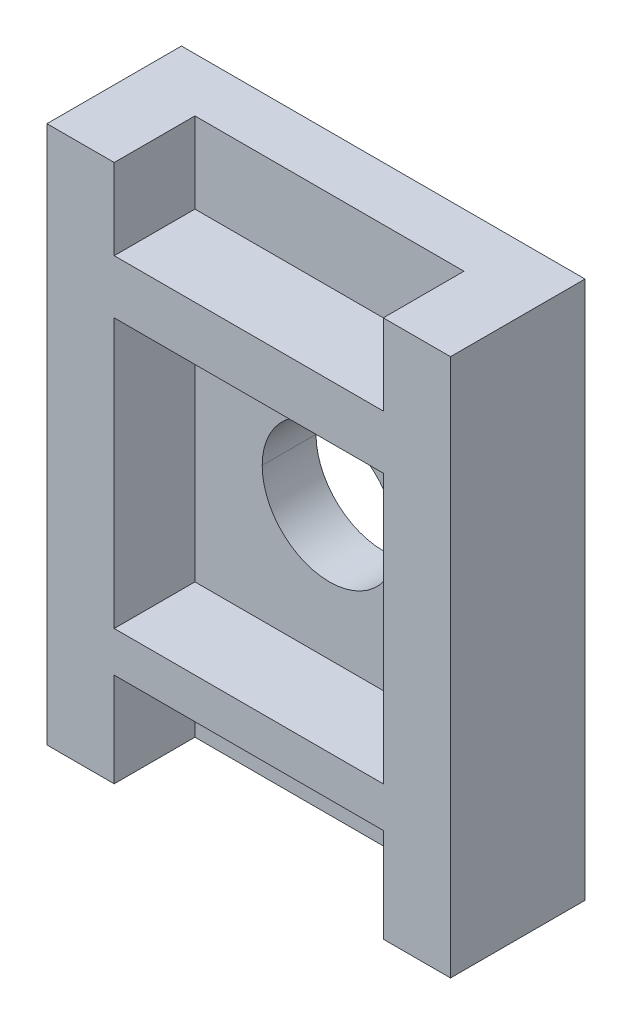
ISO-10303-21;
HEADER;
FILE_DESCRIPTION(('STEP AP214'),'2;1');
FILE_NAME('part.step','',(''),(''),'','','');
FILE_SCHEMA(('AUTOMOTIVE_DESIGN { 1 0 10303 214 1 1 1 1 }'));
ENDSEC;
DATA;
#1=APPLICATION_CONTEXT('core data for automotive mechanical design processes');
#2=APPLICATION_PROTOCOL_DEFINITION('international standard','automotive_design',2000,#1);
#3=PRODUCT_CONTEXT('',#1,'mechanical');
#4=PRODUCT('Part','Part','',(#3));
#5=PRODUCT_RELATED_PRODUCT_CATEGORY('part','',(#4));
#6=PRODUCT_DEFINITION_FORMATION('','',#4);
#7=PRODUCT_DEFINITION_CONTEXT('part definition',#1,'design');
#8=PRODUCT_DEFINITION('design','',#6,#7);
#9=PRODUCT_DEFINITION_SHAPE('','',#8);
#10=(LENGTH_UNIT() NAMED_UNIT(*) SI_UNIT(.MILLI.,.METRE.));
#11=(NAMED_UNIT(*) PLANE_ANGLE_UNIT() SI_UNIT($,.RADIAN.));
#12=(NAMED_UNIT(*) SI_UNIT($,.STERADIAN.) SOLID_ANGLE_UNIT());
#13=UNCERTAINTY_MEASURE_WITH_UNIT(LENGTH_MEASURE(1.E-05),#10,'distance_accuracy_value','');
#14=(GEOMETRIC_REPRESENTATION_CONTEXT(3) GLOBAL_UNCERTAINTY_ASSIGNED_CONTEXT((#13)) GLOBAL_UNIT_ASSIGNED_CONTEXT((#10,
#11,#12)) REPRESENTATION_CONTEXT('',''));
#15=CARTESIAN_POINT('',(0.,0.,0.));
#16=DIRECTION('',(0.,0.,1.));
#17=DIRECTION('',(1.,0.,0.));
#18=AXIS2_PLACEMENT_3D('',#15,#16,#17);
#19=CARTESIAN_POINT('',(0.,0.,2.));
#20=DIRECTION('',(0.,0.,-1.));
#21=DIRECTION('',(0.,-1.,0.));
#22=AXIS2_PLACEMENT_3D('',#19,#20,#21);
#23=PLANE('',#22);
#24=DIRECTION('',(0.,-1.,0.));
#25=VECTOR('',#24,1.);
#26=CARTESIAN_POINT('',(2.5,0.,2.));
#27=LINE('',#26,#25);
#28=CARTESIAN_POINT('',(2.5,3.5,2.));
#29=VERTEX_POINT('',#28);
#30=CARTESIAN_POINT('',(2.5,0.,2.));
#31=VERTEX_POINT('',#30);
#32=EDGE_CURVE('E219',#29,#31,#27,.T.);
#33=ORIENTED_EDGE('',*,*,#32,.T.);
#34=DIRECTION('',(1.,0.,0.));
#35=VECTOR('',#34,1.);
#36=CARTESIAN_POINT('',(2.5,0.,2.));
#37=LINE('',#36,#35);
#38=CARTESIAN_POINT('',(12.5,0.,2.));
#39=VERTEX_POINT('',#38);
#40=EDGE_CURVE('E266',#31,#39,#37,.T.);
#41=ORIENTED_EDGE('',*,*,#40,.T.);
#42=DIRECTION('',(0.,1.,0.));
#43=VECTOR('',#42,1.);
#44=CARTESIAN_POINT('',(12.5,0.,2.));
#45=LINE('',#44,#43);
#46=CARTESIAN_POINT('',(12.5,3.5,2.));
#47=VERTEX_POINT('',#46);
#48=EDGE_CURVE('E11',#39,#47,#45,.T.);
#49=ORIENTED_EDGE('',*,*,#48,.T.);
#50=DIRECTION('',(-1.,0.,0.));
#51=VECTOR('',#50,1.);
#52=CARTESIAN_POINT('',(2.5,3.5,2.));
#53=LINE('',#52,#51);
#54=EDGE_CURVE('E21',#47,#29,#53,.T.);
#55=ORIENTED_EDGE('',*,*,#54,.T.);
#56=EDGE_LOOP('',(#33,#41,#49,#55));
#57=FACE_BOUND('',#56,.T.);
#58=ADVANCED_FACE('F17',(#57),#23,.F.);
#59=CARTESIAN_POINT('',(12.5,0.,2.));
#60=DIRECTION('',(1.,0.,0.));
#61=DIRECTION('',(0.,1.,0.));
#62=AXIS2_PLACEMENT_3D('',#59,#60,#61);
#63=PLANE('',#62);
#64=DIRECTION('',(0.,1.,0.));
#65=VECTOR('',#64,1.);
#66=CARTESIAN_POINT('',(12.5,0.,5.));
#67=LINE('',#66,#65);
#68=CARTESIAN_POINT('',(12.5,0.,5.));
#69=VERTEX_POINT('',#68);
#70=CARTESIAN_POINT('',(12.5,3.5,5.));
#71=VERTEX_POINT('',#70);
#72=EDGE_CURVE('E321',#69,#71,#67,.T.);
#73=ORIENTED_EDGE('',*,*,#72,.T.);
#74=DIRECTION('',(0.,0.,1.));
#75=VECTOR('',#74,1.);
#76=CARTESIAN_POINT('',(12.5,3.5,2.));
#77=LINE('',#76,#75);
#78=EDGE_CURVE('E28',#47,#71,#77,.T.);
#79=ORIENTED_EDGE('',*,*,#78,.F.);
#80=ORIENTED_EDGE('',*,*,#48,.F.);
#81=DIRECTION('',(0.,0.,1.));
#82=VECTOR('',#81,1.);
#83=CARTESIAN_POINT('',(12.5,0.,2.));
#84=LINE('',#83,#82);
#85=EDGE_CURVE('E298',#39,#69,#84,.T.);
#86=ORIENTED_EDGE('',*,*,#85,.T.);
#87=EDGE_LOOP('',(#73,#79,#80,#86));
#88=FACE_BOUND('',#87,.T.);
#89=ADVANCED_FACE('F422',(#88),#63,.F.);
#90=CARTESIAN_POINT('',(2.5,3.5,2.));
#91=DIRECTION('',(0.,1.,0.));
#92=DIRECTION('',(1.,0.,0.));
#93=AXIS2_PLACEMENT_3D('',#90,#91,#92);
#94=PLANE('',#93);
#95=DIRECTION('',(-1.,0.,0.));
#96=VECTOR('',#95,1.);
#97=CARTESIAN_POINT('',(2.5,3.5,5.));
#98=LINE('',#97,#96);
#99=CARTESIAN_POINT('',(2.5,3.5,5.));
#100=VERTEX_POINT('',#99);
#101=EDGE_CURVE('E326',#71,#100,#98,.T.);
#102=ORIENTED_EDGE('',*,*,#101,.T.);
#103=DIRECTION('',(0.,0.,1.));
#104=VECTOR('',#103,1.);
#105=CARTESIAN_POINT('',(2.5,3.5,2.));
#106=LINE('',#105,#104);
#107=EDGE_CURVE('E289',#29,#100,#106,.T.);
#108=ORIENTED_EDGE('',*,*,#107,.F.);
#109=ORIENTED_EDGE('',*,*,#54,.F.);
#110=ORIENTED_EDGE('',*,*,#78,.T.);
#111=EDGE_LOOP('',(#102,#108,#109,#110));
#112=FACE_BOUND('',#111,.T.);
#113=ADVANCED_FACE('F419',(#112),#94,.F.);
#114=CARTESIAN_POINT('',(2.5,0.,2.));
#115=DIRECTION('',(-1.,0.,0.));
#116=DIRECTION('',(0.,0.,1.));
#117=AXIS2_PLACEMENT_3D('',#114,#115,#116);
#118=PLANE('',#117);
#119=DIRECTION('',(0.,-1.,0.));
#120=VECTOR('',#119,1.);
#121=CARTESIAN_POINT('',(2.5,0.,5.));
#122=LINE('',#121,#120);
#123=CARTESIAN_POINT('',(2.5,0.,5.));
#124=VERTEX_POINT('',#123);
#125=EDGE_CURVE('E319',#100,#124,#122,.T.);
#126=ORIENTED_EDGE('',*,*,#125,.T.);
#127=DIRECTION('',(0.,0.,1.));
#128=VECTOR('',#127,1.);
#129=CARTESIAN_POINT('',(2.5,0.,2.));
#130=LINE('',#129,#128);
#131=EDGE_CURVE('E268',#31,#124,#130,.T.);
#132=ORIENTED_EDGE('',*,*,#131,.F.);
#133=ORIENTED_EDGE('',*,*,#32,.F.);
#134=ORIENTED_EDGE('',*,*,#107,.T.);
#135=EDGE_LOOP('',(#126,#132,#133,#134));
#136=FACE_BOUND('',#135,.T.);
#137=ADVANCED_FACE('F415',(#136),#118,.F.);
#138=CARTESIAN_POINT('',(0.,0.,2.));
#139=DIRECTION('',(0.,0.,-1.));
#140=DIRECTION('',(0.,-1.,0.));
#141=AXIS2_PLACEMENT_3D('',#138,#139,#140);
#142=PLANE('',#141);
#143=DIRECTION('',(0.,1.,0.));
#144=VECTOR('',#143,1.);
#145=CARTESIAN_POINT('',(12.5,20.,2.));
#146=LINE('',#145,#144);
#147=CARTESIAN_POINT('',(12.5,17.,2.));
#148=VERTEX_POINT('',#147);
#149=CARTESIAN_POINT('',(12.5,20.,2.));
#150=VERTEX_POINT('',#149);
#151=EDGE_CURVE('E180',#148,#150,#146,.T.);
#152=ORIENTED_EDGE('',*,*,#151,.T.);
#153=DIRECTION('',(-1.,0.,0.));
#154=VECTOR('',#153,1.);
#155=CARTESIAN_POINT('',(12.5,20.,2.));
#156=LINE('',#155,#154);
#157=CARTESIAN_POINT('',(2.5,20.,2.));
#158=VERTEX_POINT('',#157);
#159=EDGE_CURVE('E311',#150,#158,#156,.T.);
#160=ORIENTED_EDGE('',*,*,#159,.T.);
#161=DIRECTION('',(0.,-1.,0.));
#162=VECTOR('',#161,1.);
#163=CARTESIAN_POINT('',(2.5,20.,2.));
#164=LINE('',#163,#162);
#165=CARTESIAN_POINT('',(2.5,17.,2.));
#166=VERTEX_POINT('',#165);
#167=EDGE_CURVE('E182',#158,#166,#164,.T.);
#168=ORIENTED_EDGE('',*,*,#167,.T.);
#169=DIRECTION('',(1.,0.,0.));
#170=VECTOR('',#169,1.);
#171=CARTESIAN_POINT('',(12.5,17.,2.));
#172=LINE('',#171,#170);
#173=EDGE_CURVE('E175',#166,#148,#172,.T.);
#174=ORIENTED_EDGE('',*,*,#173,.T.);
#175=EDGE_LOOP('',(#152,#160,#168,#174));
#176=FACE_BOUND('',#175,.T.);
#177=ADVANCED_FACE('F177',(#176),#142,.F.);
#178=CARTESIAN_POINT('',(2.5,20.,2.));
#179=DIRECTION('',(-1.,0.,0.));
#180=DIRECTION('',(0.,1.,0.));
#181=AXIS2_PLACEMENT_3D('',#178,#179,#180);
#182=PLANE('',#181);
#183=DIRECTION('',(0.,-1.,0.));
#184=VECTOR('',#183,1.);
#185=CARTESIAN_POINT('',(2.5,20.,5.));
#186=LINE('',#185,#184);
#187=CARTESIAN_POINT('',(2.5,20.,5.));
#188=VERTEX_POINT('',#187);
#189=CARTESIAN_POINT('',(2.5,17.,5.));
#190=VERTEX_POINT('',#189);
#191=EDGE_CURVE('E235',#188,#190,#186,.T.);
#192=ORIENTED_EDGE('',*,*,#191,.T.);
#193=DIRECTION('',(0.,0.,1.));
#194=VECTOR('',#193,1.);
#195=CARTESIAN_POINT('',(2.5,17.,2.));
#196=LINE('',#195,#194);
#197=EDGE_CURVE('E187',#166,#190,#196,.T.);
#198=ORIENTED_EDGE('',*,*,#197,.F.);
#199=ORIENTED_EDGE('',*,*,#167,.F.);
#200=DIRECTION('',(0.,0.,1.));
#201=VECTOR('',#200,1.);
#202=CARTESIAN_POINT('',(2.5,20.,2.));
#203=LINE('',#202,#201);
#204=EDGE_CURVE('E238',#158,#188,#203,.T.);
#205=ORIENTED_EDGE('',*,*,#204,.T.);
#206=EDGE_LOOP('',(#192,#198,#199,#205));
#207=FACE_BOUND('',#206,.T.);
#208=ADVANCED_FACE('F236',(#207),#182,.F.);
#209=CARTESIAN_POINT('',(12.5,17.,2.));
#210=DIRECTION('',(0.,-1.,0.));
#211=DIRECTION('',(0.,0.,-1.));
#212=AXIS2_PLACEMENT_3D('',#209,#210,#211);
#213=PLANE('',#212);
#214=DIRECTION('',(1.,0.,0.));
#215=VECTOR('',#214,1.);
#216=CARTESIAN_POINT('',(12.5,17.,5.));
#217=LINE('',#216,#215);
#218=CARTESIAN_POINT('',(12.5,17.,5.));
#219=VERTEX_POINT('',#218);
#220=EDGE_CURVE('E193',#190,#219,#217,.T.);
#221=ORIENTED_EDGE('',*,*,#220,.T.);
#222=DIRECTION('',(0.,0.,1.));
#223=VECTOR('',#222,1.);
#224=CARTESIAN_POINT('',(12.5,17.,2.));
#225=LINE('',#224,#223);
#226=EDGE_CURVE('E188',#148,#219,#225,.T.);
#227=ORIENTED_EDGE('',*,*,#226,.F.);
#228=ORIENTED_EDGE('',*,*,#173,.F.);
#229=ORIENTED_EDGE('',*,*,#197,.T.);
#230=EDGE_LOOP('',(#221,#227,#228,#229));
#231=FACE_BOUND('',#230,.T.);
#232=ADVANCED_FACE('F191',(#231),#213,.F.);
#233=CARTESIAN_POINT('',(12.5,20.,2.));
#234=DIRECTION('',(1.,0.,0.));
#235=DIRECTION('',(0.,1.,0.));
#236=AXIS2_PLACEMENT_3D('',#233,#234,#235);
#237=PLANE('',#236);
#238=DIRECTION('',(0.,1.,0.));
#239=VECTOR('',#238,1.);
#240=CARTESIAN_POINT('',(12.5,20.,5.));
#241=LINE('',#240,#239);
#242=CARTESIAN_POINT('',(12.5,20.,5.));
#243=VERTEX_POINT('',#242);
#244=EDGE_CURVE('E248',#219,#243,#241,.T.);
#245=ORIENTED_EDGE('',*,*,#244,.T.);
#246=DIRECTION('',(0.,0.,1.));
#247=VECTOR('',#246,1.);
#248=CARTESIAN_POINT('',(12.5,20.,2.));
#249=LINE('',#248,#247);
#250=EDGE_CURVE('E200',#150,#243,#249,.T.);
#251=ORIENTED_EDGE('',*,*,#250,.F.);
#252=ORIENTED_EDGE('',*,*,#151,.F.);
#253=ORIENTED_EDGE('',*,*,#226,.T.);
#254=EDGE_LOOP('',(#245,#251,#252,#253));
#255=FACE_BOUND('',#254,.T.);
#256=ADVANCED_FACE('F199',(#255),#237,.F.);
#257=CARTESIAN_POINT('',(0.,0.,2.));
#258=DIRECTION('',(0.,0.,1.));
#259=DIRECTION('',(1.,0.,0.));
#260=AXIS2_PLACEMENT_3D('',#257,#258,#259);
#261=PLANE('',#260);
#262=CARTESIAN_POINT('',(7.5,10.0000000000006,2.));
#263=DIRECTION('',(0.,0.,1.));
#264=DIRECTION('',(1.,0.,0.));
#265=AXIS2_PLACEMENT_3D('',#262,#263,#264);
#266=CIRCLE('',#265,2.5);
#267=CARTESIAN_POINT('',(5.,10.0000000000006,2.));
#268=VERTEX_POINT('',#267);
#269=CARTESIAN_POINT('',(10.,10.0000000000006,2.));
#270=VERTEX_POINT('',#269);
#271=EDGE_CURVE('E334',#268,#270,#266,.T.);
#272=ORIENTED_EDGE('',*,*,#271,.F.);
#273=CARTESIAN_POINT('',(7.5,10.0000000000006,2.));
#274=DIRECTION('',(0.,0.,1.));
#275=DIRECTION('',(1.,0.,0.));
#276=AXIS2_PLACEMENT_3D('',#273,#274,#275);
#277=CIRCLE('',#276,2.5);
#278=EDGE_CURVE('E330',#270,#268,#277,.T.);
#279=ORIENTED_EDGE('',*,*,#278,.F.);
#280=EDGE_LOOP('',(#272,#279));
#281=FACE_BOUND('',#280,.T.);
#282=DIRECTION('',(0.,-1.,0.));
#283=VECTOR('',#282,1.);
#284=CARTESIAN_POINT('',(2.5,15.,2.));
#285=LINE('',#284,#283);
#286=CARTESIAN_POINT('',(2.5,15.,2.));
#287=VERTEX_POINT('',#286);
#288=CARTESIAN_POINT('',(2.5,5.,2.));
#289=VERTEX_POINT('',#288);
#290=EDGE_CURVE('E367',#287,#289,#285,.T.);
#291=ORIENTED_EDGE('',*,*,#290,.T.);
#292=DIRECTION('',(1.,0.,0.));
#293=VECTOR('',#292,1.);
#294=CARTESIAN_POINT('',(2.5,5.,2.));
#295=LINE('',#294,#293);
#296=CARTESIAN_POINT('',(12.5,5.,2.));
#297=VERTEX_POINT('',#296);
#298=EDGE_CURVE('E203',#289,#297,#295,.T.);
#299=ORIENTED_EDGE('',*,*,#298,.T.);
#300=DIRECTION('',(0.,1.,0.));
#301=VECTOR('',#300,1.);
#302=CARTESIAN_POINT('',(12.5,15.,2.));
#303=LINE('',#302,#301);
#304=CARTESIAN_POINT('',(12.5,15.,2.));
#305=VERTEX_POINT('',#304);
#306=EDGE_CURVE('E217',#297,#305,#303,.T.);
#307=ORIENTED_EDGE('',*,*,#306,.T.);
#308=DIRECTION('',(-1.,0.,0.));
#309=VECTOR('',#308,1.);
#310=CARTESIAN_POINT('',(2.5,15.,2.));
#311=LINE('',#310,#309);
#312=EDGE_CURVE('E293',#305,#287,#311,.T.);
#313=ORIENTED_EDGE('',*,*,#312,.T.);
#314=EDGE_LOOP('',(#291,#299,#307,#313));
#315=FACE_BOUND('',#314,.T.);
#316=ADVANCED_FACE('F503',(#281,#315),#261,.T.);
#317=CARTESIAN_POINT('',(2.5,5.,2.));
#318=DIRECTION('',(0.,-1.,0.));
#319=DIRECTION('',(0.,0.,-1.));
#320=AXIS2_PLACEMENT_3D('',#317,#318,#319);
#321=PLANE('',#320);
#322=DIRECTION('',(1.,0.,0.));
#323=VECTOR('',#322,1.);
#324=CARTESIAN_POINT('',(2.5,5.,5.));
#325=LINE('',#324,#323);
#326=CARTESIAN_POINT('',(2.5,5.,5.));
#327=VERTEX_POINT('',#326);
#328=CARTESIAN_POINT('',(12.5,5.,5.));
#329=VERTEX_POINT('',#328);
#330=EDGE_CURVE('E265',#327,#329,#325,.T.);
#331=ORIENTED_EDGE('',*,*,#330,.T.);
#332=DIRECTION('',(0.,0.,1.));
#333=VECTOR('',#332,1.);
#334=CARTESIAN_POINT('',(12.5,5.,2.));
#335=LINE('',#334,#333);
#336=EDGE_CURVE('E210',#297,#329,#335,.T.);
#337=ORIENTED_EDGE('',*,*,#336,.F.);
#338=ORIENTED_EDGE('',*,*,#298,.F.);
#339=DIRECTION('',(0.,0.,1.));
#340=VECTOR('',#339,1.);
#341=CARTESIAN_POINT('',(2.5,5.,2.));
#342=LINE('',#341,#340);
#343=EDGE_CURVE('E301',#289,#327,#342,.T.);
#344=ORIENTED_EDGE('',*,*,#343,.T.);
#345=EDGE_LOOP('',(#331,#337,#338,#344));
#346=FACE_BOUND('',#345,.T.);
#347=ADVANCED_FACE('F499',(#346),#321,.F.);
#348=CARTESIAN_POINT('',(12.5,15.,2.));
#349=DIRECTION('',(1.,0.,0.));
#350=DIRECTION('',(0.,1.,0.));
#351=AXIS2_PLACEMENT_3D('',#348,#349,#350);
#352=PLANE('',#351);
#353=DIRECTION('',(0.,1.,0.));
#354=VECTOR('',#353,1.);
#355=CARTESIAN_POINT('',(12.5,15.,5.));
#356=LINE('',#355,#354);
#357=CARTESIAN_POINT('',(12.5,15.,5.));
#358=VERTEX_POINT('',#357);
#359=EDGE_CURVE('E338',#329,#358,#356,.T.);
#360=ORIENTED_EDGE('',*,*,#359,.T.);
#361=DIRECTION('',(0.,0.,1.));
#362=VECTOR('',#361,1.);
#363=CARTESIAN_POINT('',(12.5,15.,2.));
#364=LINE('',#363,#362);
#365=EDGE_CURVE('E290',#305,#358,#364,.T.);
#366=ORIENTED_EDGE('',*,*,#365,.F.);
#367=ORIENTED_EDGE('',*,*,#306,.F.);
#368=ORIENTED_EDGE('',*,*,#336,.T.);
#369=EDGE_LOOP('',(#360,#366,#367,#368));
#370=FACE_BOUND('',#369,.T.);
#371=ADVANCED_FACE('F483',(#370),#352,.F.);
#372=CARTESIAN_POINT('',(2.5,15.,2.));
#373=DIRECTION('',(0.,1.,0.));
#374=DIRECTION('',(1.,0.,0.));
#375=AXIS2_PLACEMENT_3D('',#372,#373,#374);
#376=PLANE('',#375);
#377=DIRECTION('',(-1.,0.,0.));
#378=VECTOR('',#377,1.);
#379=CARTESIAN_POINT('',(2.5,15.,5.));
#380=LINE('',#379,#378);
#381=CARTESIAN_POINT('',(2.5,15.,5.));
#382=VERTEX_POINT('',#381);
#383=EDGE_CURVE('E264',#358,#382,#380,.T.);
#384=ORIENTED_EDGE('',*,*,#383,.T.);
#385=DIRECTION('',(0.,0.,1.));
#386=VECTOR('',#385,1.);
#387=CARTESIAN_POINT('',(2.5,15.,2.));
#388=LINE('',#387,#386);
#389=EDGE_CURVE('E374',#287,#382,#388,.T.);
#390=ORIENTED_EDGE('',*,*,#389,.F.);
#391=ORIENTED_EDGE('',*,*,#312,.F.);
#392=ORIENTED_EDGE('',*,*,#365,.T.);
#393=EDGE_LOOP('',(#384,#390,#391,#392));
#394=FACE_BOUND('',#393,.T.);
#395=ADVANCED_FACE('F478',(#394),#376,.F.);
#396=CARTESIAN_POINT('',(2.5,15.,2.));
#397=DIRECTION('',(-1.,0.,0.));
#398=DIRECTION('',(0.,1.,0.));
#399=AXIS2_PLACEMENT_3D('',#396,#397,#398);
#400=PLANE('',#399);
#401=DIRECTION('',(0.,-1.,0.));
#402=VECTOR('',#401,1.);
#403=CARTESIAN_POINT('',(2.5,15.,5.));
#404=LINE('',#403,#402);
#405=EDGE_CURVE('E262',#382,#327,#404,.T.);
#406=ORIENTED_EDGE('',*,*,#405,.T.);
#407=ORIENTED_EDGE('',*,*,#343,.F.);
#408=ORIENTED_EDGE('',*,*,#290,.F.);
#409=ORIENTED_EDGE('',*,*,#389,.T.);
#410=EDGE_LOOP('',(#406,#407,#408,#409));
#411=FACE_BOUND('',#410,.T.);
#412=ADVANCED_FACE('F482',(#411),#400,.F.);
#413=CARTESIAN_POINT('',(0.,20.,5.));
#414=DIRECTION('',(0.,-1.,0.));
#415=DIRECTION('',(0.,0.,-1.));
#416=AXIS2_PLACEMENT_3D('',#413,#414,#415);
#417=PLANE('',#416);
#418=ORIENTED_EDGE('',*,*,#159,.F.);
#419=ORIENTED_EDGE('',*,*,#250,.T.);
#420=DIRECTION('',(-1.,0.,0.));
#421=VECTOR('',#420,1.);
#422=CARTESIAN_POINT('',(0.,20.,5.));
#423=LINE('',#422,#421);
#424=CARTESIAN_POINT('',(15.,20.,5.));
#425=VERTEX_POINT('',#424);
#426=EDGE_CURVE('E256',#425,#243,#423,.T.);
#427=ORIENTED_EDGE('',*,*,#426,.F.);
#428=DIRECTION('',(0.,0.,-1.));
#429=VECTOR('',#428,1.);
#430=CARTESIAN_POINT('',(15.,20.,5.));
#431=LINE('',#430,#429);
#432=CARTESIAN_POINT('',(15.,20.,0.));
#433=VERTEX_POINT('',#432);
#434=EDGE_CURVE('E314',#425,#433,#431,.T.);
#435=ORIENTED_EDGE('',*,*,#434,.T.);
#436=DIRECTION('',(-1.,0.,0.));
#437=VECTOR('',#436,1.);
#438=CARTESIAN_POINT('',(0.,20.,0.));
#439=LINE('',#438,#437);
#440=CARTESIAN_POINT('',(0.,20.,0.));
#441=VERTEX_POINT('',#440);
#442=EDGE_CURVE('E214',#433,#441,#439,.T.);
#443=ORIENTED_EDGE('',*,*,#442,.T.);
#444=DIRECTION('',(0.,0.,-1.));
#445=VECTOR('',#444,1.);
#446=CARTESIAN_POINT('',(0.,20.,5.));
#447=LINE('',#446,#445);
#448=CARTESIAN_POINT('',(0.,20.,5.));
#449=VERTEX_POINT('',#448);
#450=EDGE_CURVE('E269',#449,#441,#447,.T.);
#451=ORIENTED_EDGE('',*,*,#450,.F.);
#452=DIRECTION('',(-1.,0.,0.));
#453=VECTOR('',#452,1.);
#454=CARTESIAN_POINT('',(0.,20.,5.));
#455=LINE('',#454,#453);
#456=EDGE_CURVE('E243',#188,#449,#455,.T.);
#457=ORIENTED_EDGE('',*,*,#456,.F.);
#458=ORIENTED_EDGE('',*,*,#204,.F.);
#459=EDGE_LOOP('',(#418,#419,#427,#435,#443,#451,#457,#458));
#460=FACE_BOUND('',#459,.T.);
#461=ADVANCED_FACE('F404',(#460),#417,.F.);
#462=CARTESIAN_POINT('',(15.,0.,5.));
#463=DIRECTION('',(-1.,0.,0.));
#464=DIRECTION('',(0.,1.,0.));
#465=AXIS2_PLACEMENT_3D('',#462,#463,#464);
#466=PLANE('',#465);
#467=DIRECTION('',(0.,1.,0.));
#468=VECTOR('',#467,1.);
#469=CARTESIAN_POINT('',(15.,0.,0.));
#470=LINE('',#469,#468);
#471=CARTESIAN_POINT('',(15.,0.,0.));
#472=VERTEX_POINT('',#471);
#473=EDGE_CURVE('E227',#472,#433,#470,.T.);
#474=ORIENTED_EDGE('',*,*,#473,.T.);
#475=ORIENTED_EDGE('',*,*,#434,.F.);
#476=DIRECTION('',(0.,1.,0.));
#477=VECTOR('',#476,1.);
#478=CARTESIAN_POINT('',(15.,0.,5.));
#479=LINE('',#478,#477);
#480=CARTESIAN_POINT('',(15.,0.,5.));
#481=VERTEX_POINT('',#480);
#482=EDGE_CURVE('E260',#481,#425,#479,.T.);
#483=ORIENTED_EDGE('',*,*,#482,.F.);
#484=DIRECTION('',(0.,0.,-1.));
#485=VECTOR('',#484,1.);
#486=CARTESIAN_POINT('',(15.,0.,5.));
#487=LINE('',#486,#485);
#488=EDGE_CURVE('E275',#481,#472,#487,.T.);
#489=ORIENTED_EDGE('',*,*,#488,.T.);
#490=EDGE_LOOP('',(#474,#475,#483,#489));
#491=FACE_BOUND('',#490,.T.);
#492=ADVANCED_FACE('F400',(#491),#466,.F.);
#493=CARTESIAN_POINT('',(0.,0.,5.));
#494=DIRECTION('',(0.,1.,0.));
#495=DIRECTION('',(1.,0.,0.));
#496=AXIS2_PLACEMENT_3D('',#493,#494,#495);
#497=PLANE('',#496);
#498=ORIENTED_EDGE('',*,*,#40,.F.);
#499=ORIENTED_EDGE('',*,*,#131,.T.);
#500=DIRECTION('',(1.,0.,0.));
#501=VECTOR('',#500,1.);
#502=CARTESIAN_POINT('',(0.,0.,5.));
#503=LINE('',#502,#501);
#504=CARTESIAN_POINT('',(0.,0.,5.));
#505=VERTEX_POINT('',#504);
#506=EDGE_CURVE('E316',#505,#124,#503,.T.);
#507=ORIENTED_EDGE('',*,*,#506,.F.);
#508=DIRECTION('',(0.,0.,-1.));
#509=VECTOR('',#508,1.);
#510=CARTESIAN_POINT('',(0.,0.,5.));
#511=LINE('',#510,#509);
#512=CARTESIAN_POINT('',(0.,0.,0.));
#513=VERTEX_POINT('',#512);
#514=EDGE_CURVE('E226',#505,#513,#511,.T.);
#515=ORIENTED_EDGE('',*,*,#514,.T.);
#516=DIRECTION('',(1.,0.,0.));
#517=VECTOR('',#516,1.);
#518=CARTESIAN_POINT('',(0.,0.,0.));
#519=LINE('',#518,#517);
#520=EDGE_CURVE('E223',#513,#472,#519,.T.);
#521=ORIENTED_EDGE('',*,*,#520,.T.);
#522=ORIENTED_EDGE('',*,*,#488,.F.);
#523=DIRECTION('',(1.,0.,0.));
#524=VECTOR('',#523,1.);
#525=CARTESIAN_POINT('',(0.,0.,5.));
#526=LINE('',#525,#524);
#527=EDGE_CURVE('E325',#69,#481,#526,.T.);
#528=ORIENTED_EDGE('',*,*,#527,.F.);
#529=ORIENTED_EDGE('',*,*,#85,.F.);
#530=EDGE_LOOP('',(#498,#499,#507,#515,#521,#522,#528,#529));
#531=FACE_BOUND('',#530,.T.);
#532=ADVANCED_FACE('F408',(#531),#497,.F.);
#533=CARTESIAN_POINT('',(0.,0.,5.));
#534=DIRECTION('',(1.,0.,0.));
#535=DIRECTION('',(0.,1.,0.));
#536=AXIS2_PLACEMENT_3D('',#533,#534,#535);
#537=PLANE('',#536);
#538=DIRECTION('',(0.,-1.,0.));
#539=VECTOR('',#538,1.);
#540=CARTESIAN_POINT('',(0.,0.,0.));
#541=LINE('',#540,#539);
#542=EDGE_CURVE('E344',#441,#513,#541,.T.);
#543=ORIENTED_EDGE('',*,*,#542,.T.);
#544=ORIENTED_EDGE('',*,*,#514,.F.);
#545=DIRECTION('',(0.,-1.,0.));
#546=VECTOR('',#545,1.);
#547=CARTESIAN_POINT('',(0.,0.,5.));
#548=LINE('',#547,#546);
#549=EDGE_CURVE('E351',#449,#505,#548,.T.);
#550=ORIENTED_EDGE('',*,*,#549,.F.);
#551=ORIENTED_EDGE('',*,*,#450,.T.);
#552=EDGE_LOOP('',(#543,#544,#550,#551));
#553=FACE_BOUND('',#552,.T.);
#554=ADVANCED_FACE('F470',(#553),#537,.F.);
#555=CARTESIAN_POINT('',(0.,0.,0.));
#556=DIRECTION('',(0.,0.,-1.));
#557=DIRECTION('',(0.,-1.,0.));
#558=AXIS2_PLACEMENT_3D('',#555,#556,#557);
#559=PLANE('',#558);
#560=CARTESIAN_POINT('',(7.5,10.0000000000006,0.));
#561=DIRECTION('',(0.,0.,1.));
#562=DIRECTION('',(1.,0.,0.));
#563=AXIS2_PLACEMENT_3D('',#560,#561,#562);
#564=CIRCLE('',#563,2.5);
#565=CARTESIAN_POINT('',(5.,10.0000000000006,0.));
#566=VERTEX_POINT('',#565);
#567=CARTESIAN_POINT('',(10.,10.0000000000006,0.));
#568=VERTEX_POINT('',#567);
#569=EDGE_CURVE('E304',#566,#568,#564,.T.);
#570=ORIENTED_EDGE('',*,*,#569,.T.);
#571=CARTESIAN_POINT('',(7.5,10.0000000000006,0.));
#572=DIRECTION('',(0.,0.,1.));
#573=DIRECTION('',(1.,0.,0.));
#574=AXIS2_PLACEMENT_3D('',#571,#572,#573);
#575=CIRCLE('',#574,2.5);
#576=EDGE_CURVE('E320',#568,#566,#575,.T.);
#577=ORIENTED_EDGE('',*,*,#576,.T.);
#578=EDGE_LOOP('',(#570,#577));
#579=FACE_BOUND('',#578,.T.);
#580=ORIENTED_EDGE('',*,*,#542,.F.);
#581=ORIENTED_EDGE('',*,*,#442,.F.);
#582=ORIENTED_EDGE('',*,*,#473,.F.);
#583=ORIENTED_EDGE('',*,*,#520,.F.);
#584=EDGE_LOOP('',(#580,#581,#582,#583));
#585=FACE_BOUND('',#584,.T.);
#586=ADVANCED_FACE('F19',(#579,#585),#559,.T.);
#587=CARTESIAN_POINT('',(0.,0.,5.));
#588=DIRECTION('',(0.,0.,-1.));
#589=DIRECTION('',(0.,-1.,0.));
#590=AXIS2_PLACEMENT_3D('',#587,#588,#589);
#591=PLANE('',#590);
#592=ORIENTED_EDGE('',*,*,#330,.F.);
#593=ORIENTED_EDGE('',*,*,#405,.F.);
#594=ORIENTED_EDGE('',*,*,#383,.F.);
#595=ORIENTED_EDGE('',*,*,#359,.F.);
#596=EDGE_LOOP('',(#592,#593,#594,#595));
#597=FACE_BOUND('',#596,.T.);
#598=ORIENTED_EDGE('',*,*,#506,.T.);
#599=ORIENTED_EDGE('',*,*,#125,.F.);
#600=ORIENTED_EDGE('',*,*,#101,.F.);
#601=ORIENTED_EDGE('',*,*,#72,.F.);
#602=ORIENTED_EDGE('',*,*,#527,.T.);
#603=ORIENTED_EDGE('',*,*,#482,.T.);
#604=ORIENTED_EDGE('',*,*,#426,.T.);
#605=ORIENTED_EDGE('',*,*,#244,.F.);
#606=ORIENTED_EDGE('',*,*,#220,.F.);
#607=ORIENTED_EDGE('',*,*,#191,.F.);
#608=ORIENTED_EDGE('',*,*,#456,.T.);
#609=ORIENTED_EDGE('',*,*,#549,.T.);
#610=EDGE_LOOP('',(#598,#599,#600,#601,#602,#603,#604,#605,#606,#607,#608,#609));
#611=FACE_BOUND('',#610,.T.);
#612=ADVANCED_FACE('F246',(#597,#611),#591,.F.);
#613=CARTESIAN_POINT('',(7.5,10.0000000000006,5.));
#614=DIRECTION('',(0.,0.,-1.));
#615=DIRECTION('',(-1.,0.,0.));
#616=AXIS2_PLACEMENT_3D('',#613,#614,#615);
#617=CYLINDRICAL_SURFACE('',#616,2.5);
#618=DIRECTION('',(0.,0.,-1.));
#619=VECTOR('',#618,1.);
#620=CARTESIAN_POINT('',(10.,10.0000000000006,5.));
#621=LINE('',#620,#619);
#622=EDGE_CURVE('E309',#270,#568,#621,.T.);
#623=ORIENTED_EDGE('',*,*,#622,.F.);
#624=ORIENTED_EDGE('',*,*,#278,.T.);
#625=DIRECTION('',(0.,0.,-1.));
#626=VECTOR('',#625,1.);
#627=CARTESIAN_POINT('',(5.,10.0000000000006,5.));
#628=LINE('',#627,#626);
#629=EDGE_CURVE('E308',#268,#566,#628,.T.);
#630=ORIENTED_EDGE('',*,*,#629,.T.);
#631=ORIENTED_EDGE('',*,*,#576,.F.);
#632=EDGE_LOOP('',(#623,#624,#630,#631));
#633=FACE_BOUND('',#632,.T.);
#634=ADVANCED_FACE('F489',(#633),#617,.F.);
#635=CARTESIAN_POINT('',(7.5,10.0000000000006,5.));
#636=DIRECTION('',(0.,0.,-1.));
#637=DIRECTION('',(-1.,0.,0.));
#638=AXIS2_PLACEMENT_3D('',#635,#636,#637);
#639=CYLINDRICAL_SURFACE('',#638,2.5);
#640=ORIENTED_EDGE('',*,*,#271,.T.);
#641=ORIENTED_EDGE('',*,*,#622,.T.);
#642=ORIENTED_EDGE('',*,*,#569,.F.);
#643=ORIENTED_EDGE('',*,*,#629,.F.);
#644=EDGE_LOOP('',(#640,#641,#642,#643));
#645=FACE_BOUND('',#644,.T.);
#646=ADVANCED_FACE('F493',(#645),#639,.F.);
#647=CLOSED_SHELL('',(#58,#89,#113,#137,#177,#208,#232,#256,#316,#347,#371,#395,#412,#461,#492,
#532,#554,#586,#612,#634,#646));
#648=MANIFOLD_SOLID_BREP('B1',#647);
#649=ADVANCED_BREP_SHAPE_REPRESENTATION('',(#18,#648),#14);
#650=SHAPE_DEFINITION_REPRESENTATION(#9,#649);
ENDSEC;
END-ISO-10303-21;
